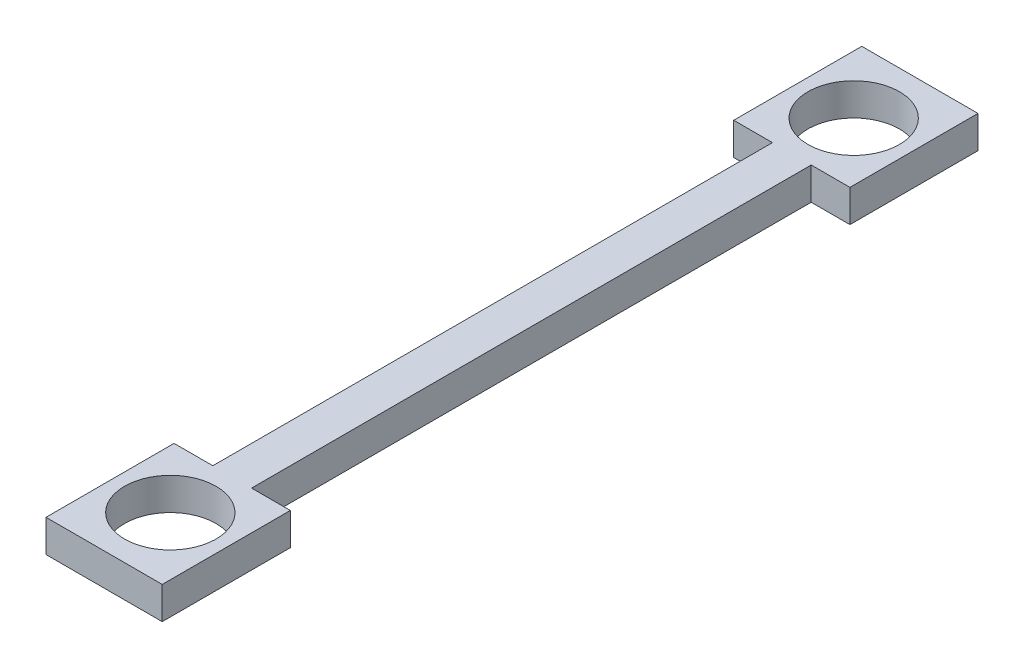
ISO-10303-21;
HEADER;
FILE_DESCRIPTION(('STEP AP214'),'2;1');
FILE_NAME('part.step','',(''),(''),'','','');
FILE_SCHEMA(('AUTOMOTIVE_DESIGN { 1 0 10303 214 1 1 1 1 }'));
ENDSEC;
DATA;
#1=APPLICATION_CONTEXT('core data for automotive mechanical design processes');
#2=APPLICATION_PROTOCOL_DEFINITION('international standard','automotive_design',2000,#1);
#3=PRODUCT_CONTEXT('',#1,'mechanical');
#4=PRODUCT('Part','Part','',(#3));
#5=PRODUCT_RELATED_PRODUCT_CATEGORY('part','',(#4));
#6=PRODUCT_DEFINITION_FORMATION('','',#4);
#7=PRODUCT_DEFINITION_CONTEXT('part definition',#1,'design');
#8=PRODUCT_DEFINITION('design','',#6,#7);
#9=PRODUCT_DEFINITION_SHAPE('','',#8);
#10=(LENGTH_UNIT() NAMED_UNIT(*) SI_UNIT(.MILLI.,.METRE.));
#11=(NAMED_UNIT(*) PLANE_ANGLE_UNIT() SI_UNIT($,.RADIAN.));
#12=(NAMED_UNIT(*) SI_UNIT($,.STERADIAN.) SOLID_ANGLE_UNIT());
#13=UNCERTAINTY_MEASURE_WITH_UNIT(LENGTH_MEASURE(1.E-05),#10,'distance_accuracy_value','');
#14=(GEOMETRIC_REPRESENTATION_CONTEXT(3) GLOBAL_UNCERTAINTY_ASSIGNED_CONTEXT((#13)) GLOBAL_UNIT_ASSIGNED_CONTEXT((#10,
#11,#12)) REPRESENTATION_CONTEXT('',''));
#15=CARTESIAN_POINT('',(0.,0.,0.));
#16=DIRECTION('',(0.,0.,1.));
#17=DIRECTION('',(1.,0.,0.));
#18=AXIS2_PLACEMENT_3D('',#15,#16,#17);
#19=CARTESIAN_POINT('',(6.50000000000001,3.,-11.5));
#20=DIRECTION('',(0.,0.,1.));
#21=DIRECTION('',(1.,0.,0.));
#22=AXIS2_PLACEMENT_3D('',#19,#20,#21);
#23=PLANE('',#22);
#24=DIRECTION('',(-1.,0.,0.));
#25=VECTOR('',#24,1.);
#26=CARTESIAN_POINT('',(6.50000000000001,0.,-11.5));
#27=LINE('',#26,#25);
#28=CARTESIAN_POINT('',(10.4,0.,-11.5));
#29=VERTEX_POINT('',#28);
#30=CARTESIAN_POINT('',(6.80000000000001,0.,-11.5));
#31=VERTEX_POINT('',#30);
#32=EDGE_CURVE('E147',#29,#31,#27,.T.);
#33=ORIENTED_EDGE('',*,*,#32,.T.);
#34=DIRECTION('',(0.,-1.,0.));
#35=VECTOR('',#34,1.);
#36=CARTESIAN_POINT('',(6.80000000000001,3.,-11.5));
#37=LINE('',#36,#35);
#38=CARTESIAN_POINT('',(6.80000000000001,3.,-11.5));
#39=VERTEX_POINT('',#38);
#40=EDGE_CURVE('E146',#39,#31,#37,.T.);
#41=ORIENTED_EDGE('',*,*,#40,.F.);
#42=DIRECTION('',(-1.,0.,0.));
#43=VECTOR('',#42,1.);
#44=CARTESIAN_POINT('',(6.50000000000001,3.,-11.5));
#45=LINE('',#44,#43);
#46=CARTESIAN_POINT('',(10.4,3.,-11.5));
#47=VERTEX_POINT('',#46);
#48=EDGE_CURVE('E132',#47,#39,#45,.T.);
#49=ORIENTED_EDGE('',*,*,#48,.F.);
#50=DIRECTION('',(0.,1.,0.));
#51=VECTOR('',#50,1.);
#52=CARTESIAN_POINT('',(10.4,0.,-11.5));
#53=LINE('',#52,#51);
#54=EDGE_CURVE('E215',#29,#47,#53,.T.);
#55=ORIENTED_EDGE('',*,*,#54,.F.);
#56=EDGE_LOOP('',(#33,#41,#49,#55));
#57=FACE_BOUND('',#56,.T.);
#58=ADVANCED_FACE('F42',(#57),#23,.F.);
#59=CARTESIAN_POINT('',(6.50000000000001,3.,-63.5));
#60=DIRECTION('',(0.,0.,-1.));
#61=DIRECTION('',(-1.,0.,0.));
#62=AXIS2_PLACEMENT_3D('',#59,#60,#61);
#63=PLANE('',#62);
#64=DIRECTION('',(1.,0.,0.));
#65=VECTOR('',#64,1.);
#66=CARTESIAN_POINT('',(6.50000000000001,3.,-63.5));
#67=LINE('',#66,#65);
#68=CARTESIAN_POINT('',(6.80000000000001,3.,-63.5));
#69=VERTEX_POINT('',#68);
#70=CARTESIAN_POINT('',(10.4,3.,-63.5));
#71=VERTEX_POINT('',#70);
#72=EDGE_CURVE('E59',#69,#71,#67,.T.);
#73=ORIENTED_EDGE('',*,*,#72,.F.);
#74=DIRECTION('',(0.,1.,0.));
#75=VECTOR('',#74,1.);
#76=CARTESIAN_POINT('',(6.80000000000001,0.,-63.5));
#77=LINE('',#76,#75);
#78=CARTESIAN_POINT('',(6.80000000000001,0.,-63.5));
#79=VERTEX_POINT('',#78);
#80=EDGE_CURVE('E157',#79,#69,#77,.T.);
#81=ORIENTED_EDGE('',*,*,#80,.F.);
#82=DIRECTION('',(1.,0.,0.));
#83=VECTOR('',#82,1.);
#84=CARTESIAN_POINT('',(6.50000000000001,0.,-63.5));
#85=LINE('',#84,#83);
#86=CARTESIAN_POINT('',(10.4,0.,-63.5));
#87=VERTEX_POINT('',#86);
#88=EDGE_CURVE('E273',#79,#87,#85,.T.);
#89=ORIENTED_EDGE('',*,*,#88,.T.);
#90=DIRECTION('',(0.,-1.,0.));
#91=VECTOR('',#90,1.);
#92=CARTESIAN_POINT('',(10.4,3.,-63.5));
#93=LINE('',#92,#91);
#94=EDGE_CURVE('E226',#71,#87,#93,.T.);
#95=ORIENTED_EDGE('',*,*,#94,.F.);
#96=EDGE_LOOP('',(#73,#81,#89,#95));
#97=FACE_BOUND('',#96,.T.);
#98=ADVANCED_FACE('F309',(#97),#63,.F.);
#99=CARTESIAN_POINT('',(0.,3.,-63.5));
#100=DIRECTION('',(0.,0.,-1.));
#101=DIRECTION('',(-1.,0.,0.));
#102=AXIS2_PLACEMENT_3D('',#99,#100,#101);
#103=PLANE('',#102);
#104=DIRECTION('',(1.,0.,0.));
#105=VECTOR('',#104,1.);
#106=CARTESIAN_POINT('',(0.,0.,-63.5));
#107=LINE('',#106,#105);
#108=CARTESIAN_POINT('',(-0.400000000000008,0.,-63.5));
#109=VERTEX_POINT('',#108);
#110=CARTESIAN_POINT('',(3.20000000000001,0.,-63.5));
#111=VERTEX_POINT('',#110);
#112=EDGE_CURVE('E275',#109,#111,#107,.T.);
#113=ORIENTED_EDGE('',*,*,#112,.T.);
#114=DIRECTION('',(0.,-1.,0.));
#115=VECTOR('',#114,1.);
#116=CARTESIAN_POINT('',(3.20000000000001,3.,-63.5));
#117=LINE('',#116,#115);
#118=CARTESIAN_POINT('',(3.20000000000001,3.,-63.5));
#119=VERTEX_POINT('',#118);
#120=EDGE_CURVE('E169',#119,#111,#117,.T.);
#121=ORIENTED_EDGE('',*,*,#120,.F.);
#122=DIRECTION('',(1.,0.,0.));
#123=VECTOR('',#122,1.);
#124=CARTESIAN_POINT('',(0.,3.,-63.5));
#125=LINE('',#124,#123);
#126=CARTESIAN_POINT('',(-0.400000000000008,3.,-63.5));
#127=VERTEX_POINT('',#126);
#128=EDGE_CURVE('E51',#127,#119,#125,.T.);
#129=ORIENTED_EDGE('',*,*,#128,.F.);
#130=DIRECTION('',(0.,1.,0.));
#131=VECTOR('',#130,1.);
#132=CARTESIAN_POINT('',(-0.400000000000008,0.,-63.5));
#133=LINE('',#132,#131);
#134=EDGE_CURVE('E185',#109,#127,#133,.T.);
#135=ORIENTED_EDGE('',*,*,#134,.F.);
#136=EDGE_LOOP('',(#113,#121,#129,#135));
#137=FACE_BOUND('',#136,.T.);
#138=ADVANCED_FACE('F302',(#137),#103,.F.);
#139=CARTESIAN_POINT('',(0.,3.,-11.5));
#140=DIRECTION('',(0.,0.,1.));
#141=DIRECTION('',(1.,0.,0.));
#142=AXIS2_PLACEMENT_3D('',#139,#140,#141);
#143=PLANE('',#142);
#144=DIRECTION('',(-1.,0.,0.));
#145=VECTOR('',#144,1.);
#146=CARTESIAN_POINT('',(0.,3.,-11.5));
#147=LINE('',#146,#145);
#148=CARTESIAN_POINT('',(3.20000000000001,3.,-11.5));
#149=VERTEX_POINT('',#148);
#150=CARTESIAN_POINT('',(-0.400000000000001,3.,-11.5));
#151=VERTEX_POINT('',#150);
#152=EDGE_CURVE('E11',#149,#151,#147,.T.);
#153=ORIENTED_EDGE('',*,*,#152,.F.);
#154=DIRECTION('',(0.,1.,0.));
#155=VECTOR('',#154,1.);
#156=CARTESIAN_POINT('',(3.20000000000001,0.,-11.5));
#157=LINE('',#156,#155);
#158=CARTESIAN_POINT('',(3.20000000000001,0.,-11.5));
#159=VERTEX_POINT('',#158);
#160=EDGE_CURVE('E177',#159,#149,#157,.T.);
#161=ORIENTED_EDGE('',*,*,#160,.F.);
#162=DIRECTION('',(-1.,0.,0.));
#163=VECTOR('',#162,1.);
#164=CARTESIAN_POINT('',(0.,0.,-11.5));
#165=LINE('',#164,#163);
#166=CARTESIAN_POINT('',(-0.400000000000001,0.,-11.5));
#167=VERTEX_POINT('',#166);
#168=EDGE_CURVE('E45',#159,#167,#165,.T.);
#169=ORIENTED_EDGE('',*,*,#168,.T.);
#170=DIRECTION('',(0.,-1.,0.));
#171=VECTOR('',#170,1.);
#172=CARTESIAN_POINT('',(-0.400000000000001,3.,-11.5));
#173=LINE('',#172,#171);
#174=EDGE_CURVE('E197',#151,#167,#173,.T.);
#175=ORIENTED_EDGE('',*,*,#174,.F.);
#176=EDGE_LOOP('',(#153,#161,#169,#175));
#177=FACE_BOUND('',#176,.T.);
#178=ADVANCED_FACE('F285',(#177),#143,.F.);
#179=CARTESIAN_POINT('',(0.,3.,0.));
#180=DIRECTION('',(0.,-1.,0.));
#181=DIRECTION('',(0.,0.,-1.));
#182=AXIS2_PLACEMENT_3D('',#179,#180,#181);
#183=PLANE('',#182);
#184=DIRECTION('',(0.,0.,1.));
#185=VECTOR('',#184,1.);
#186=CARTESIAN_POINT('',(6.80000000000001,3.,-63.5));
#187=LINE('',#186,#185);
#188=EDGE_CURVE('E137',#69,#39,#187,.T.);
#189=ORIENTED_EDGE('',*,*,#188,.F.);
#190=ORIENTED_EDGE('',*,*,#72,.T.);
#191=DIRECTION('',(0.,0.,1.));
#192=VECTOR('',#191,1.);
#193=CARTESIAN_POINT('',(10.4,3.,-75.4));
#194=LINE('',#193,#192);
#195=CARTESIAN_POINT('',(10.4,3.,-75.4));
#196=VERTEX_POINT('',#195);
#197=EDGE_CURVE('E237',#196,#71,#194,.T.);
#198=ORIENTED_EDGE('',*,*,#197,.F.);
#199=DIRECTION('',(1.,0.,0.));
#200=VECTOR('',#199,1.);
#201=CARTESIAN_POINT('',(0.,3.,-75.4));
#202=LINE('',#201,#200);
#203=CARTESIAN_POINT('',(-0.400000000000009,3.,-75.4));
#204=VERTEX_POINT('',#203);
#205=EDGE_CURVE('E67',#204,#196,#202,.T.);
#206=ORIENTED_EDGE('',*,*,#205,.F.);
#207=DIRECTION('',(0.,0.,-1.));
#208=VECTOR('',#207,1.);
#209=CARTESIAN_POINT('',(-0.400000000000008,3.,-63.5));
#210=LINE('',#209,#208);
#211=EDGE_CURVE('E181',#127,#204,#210,.T.);
#212=ORIENTED_EDGE('',*,*,#211,.F.);
#213=ORIENTED_EDGE('',*,*,#128,.T.);
#214=DIRECTION('',(0.,0.,-1.));
#215=VECTOR('',#214,1.);
#216=CARTESIAN_POINT('',(3.20000000000001,3.,-11.5));
#217=LINE('',#216,#215);
#218=EDGE_CURVE('E165',#149,#119,#217,.T.);
#219=ORIENTED_EDGE('',*,*,#218,.F.);
#220=ORIENTED_EDGE('',*,*,#152,.T.);
#221=DIRECTION('',(0.,0.,-1.));
#222=VECTOR('',#221,1.);
#223=CARTESIAN_POINT('',(-0.4,3.,0.4));
#224=LINE('',#223,#222);
#225=CARTESIAN_POINT('',(-0.4,3.,0.4));
#226=VERTEX_POINT('',#225);
#227=EDGE_CURVE('E209',#226,#151,#224,.T.);
#228=ORIENTED_EDGE('',*,*,#227,.F.);
#229=DIRECTION('',(-1.,0.,0.));
#230=VECTOR('',#229,1.);
#231=CARTESIAN_POINT('',(10.,3.,0.4));
#232=LINE('',#231,#230);
#233=CARTESIAN_POINT('',(10.4,3.,0.4));
#234=VERTEX_POINT('',#233);
#235=EDGE_CURVE('E248',#234,#226,#232,.T.);
#236=ORIENTED_EDGE('',*,*,#235,.F.);
#237=DIRECTION('',(0.,0.,1.));
#238=VECTOR('',#237,1.);
#239=CARTESIAN_POINT('',(10.4,3.,-11.5));
#240=LINE('',#239,#238);
#241=EDGE_CURVE('E139',#47,#234,#240,.T.);
#242=ORIENTED_EDGE('',*,*,#241,.F.);
#243=ORIENTED_EDGE('',*,*,#48,.T.);
#244=EDGE_LOOP('',(#189,#190,#198,#206,#212,#213,#219,#220,#228,#236,#242,#243));
#245=FACE_BOUND('',#244,.T.);
#246=CARTESIAN_POINT('',(5.,3.,-69.25));
#247=DIRECTION('',(0.,1.,0.));
#248=DIRECTION('',(0.,0.,1.));
#249=AXIS2_PLACEMENT_3D('',#246,#247,#248);
#250=CIRCLE('',#249,4.25);
#251=CARTESIAN_POINT('',(5.,3.,-65.));
#252=VERTEX_POINT('',#251);
#253=EDGE_CURVE('E256',#252,#252,#250,.T.);
#254=ORIENTED_EDGE('',*,*,#253,.F.);
#255=EDGE_LOOP('',(#254));
#256=FACE_BOUND('',#255,.T.);
#257=CARTESIAN_POINT('',(5.,3.,-5.74999999999999));
#258=DIRECTION('',(0.,1.,0.));
#259=DIRECTION('',(0.,0.,-1.));
#260=AXIS2_PLACEMENT_3D('',#257,#258,#259);
#261=CIRCLE('',#260,4.25);
#262=CARTESIAN_POINT('',(5.,3.,-9.99999999999999));
#263=VERTEX_POINT('',#262);
#264=EDGE_CURVE('E260',#263,#263,#261,.T.);
#265=ORIENTED_EDGE('',*,*,#264,.F.);
#266=EDGE_LOOP('',(#265));
#267=FACE_BOUND('',#266,.T.);
#268=ADVANCED_FACE('F134',(#245,#256,#267),#183,.F.);
#269=CARTESIAN_POINT('',(0.,0.,0.));
#270=DIRECTION('',(0.,-1.,0.));
#271=DIRECTION('',(0.,0.,-1.));
#272=AXIS2_PLACEMENT_3D('',#269,#270,#271);
#273=PLANE('',#272);
#274=ORIENTED_EDGE('',*,*,#88,.F.);
#275=DIRECTION('',(0.,0.,-1.));
#276=VECTOR('',#275,1.);
#277=CARTESIAN_POINT('',(6.80000000000001,0.,-11.5));
#278=LINE('',#277,#276);
#279=EDGE_CURVE('E152',#31,#79,#278,.T.);
#280=ORIENTED_EDGE('',*,*,#279,.F.);
#281=ORIENTED_EDGE('',*,*,#32,.F.);
#282=DIRECTION('',(0.,0.,-1.));
#283=VECTOR('',#282,1.);
#284=CARTESIAN_POINT('',(10.4,0.,0.4));
#285=LINE('',#284,#283);
#286=CARTESIAN_POINT('',(10.4,0.,0.4));
#287=VERTEX_POINT('',#286);
#288=EDGE_CURVE('E218',#287,#29,#285,.T.);
#289=ORIENTED_EDGE('',*,*,#288,.F.);
#290=DIRECTION('',(1.,0.,0.));
#291=VECTOR('',#290,1.);
#292=CARTESIAN_POINT('',(0.,0.,0.4));
#293=LINE('',#292,#291);
#294=CARTESIAN_POINT('',(-0.4,0.,0.4));
#295=VERTEX_POINT('',#294);
#296=EDGE_CURVE('E245',#295,#287,#293,.T.);
#297=ORIENTED_EDGE('',*,*,#296,.F.);
#298=DIRECTION('',(0.,0.,1.));
#299=VECTOR('',#298,1.);
#300=CARTESIAN_POINT('',(-0.400000000000001,0.,-11.5));
#301=LINE('',#300,#299);
#302=EDGE_CURVE('E201',#167,#295,#301,.T.);
#303=ORIENTED_EDGE('',*,*,#302,.F.);
#304=ORIENTED_EDGE('',*,*,#168,.F.);
#305=DIRECTION('',(0.,0.,1.));
#306=VECTOR('',#305,1.);
#307=CARTESIAN_POINT('',(3.20000000000001,0.,-63.5));
#308=LINE('',#307,#306);
#309=EDGE_CURVE('E173',#111,#159,#308,.T.);
#310=ORIENTED_EDGE('',*,*,#309,.F.);
#311=ORIENTED_EDGE('',*,*,#112,.F.);
#312=DIRECTION('',(0.,0.,1.));
#313=VECTOR('',#312,1.);
#314=CARTESIAN_POINT('',(-0.400000000000009,0.,-75.4));
#315=LINE('',#314,#313);
#316=CARTESIAN_POINT('',(-0.400000000000009,0.,-75.4));
#317=VERTEX_POINT('',#316);
#318=EDGE_CURVE('E189',#317,#109,#315,.T.);
#319=ORIENTED_EDGE('',*,*,#318,.F.);
#320=DIRECTION('',(-1.,0.,0.));
#321=VECTOR('',#320,1.);
#322=CARTESIAN_POINT('',(10.,0.,-75.4));
#323=LINE('',#322,#321);
#324=CARTESIAN_POINT('',(10.4,0.,-75.4));
#325=VERTEX_POINT('',#324);
#326=EDGE_CURVE('E240',#325,#317,#323,.T.);
#327=ORIENTED_EDGE('',*,*,#326,.F.);
#328=DIRECTION('',(0.,0.,-1.));
#329=VECTOR('',#328,1.);
#330=CARTESIAN_POINT('',(10.4,0.,-63.5));
#331=LINE('',#330,#329);
#332=EDGE_CURVE('E230',#87,#325,#331,.T.);
#333=ORIENTED_EDGE('',*,*,#332,.F.);
#334=EDGE_LOOP('',(#274,#280,#281,#289,#297,#303,#304,#310,#311,#319,#327,#333));
#335=FACE_BOUND('',#334,.T.);
#336=CARTESIAN_POINT('',(5.,0.,-69.25));
#337=DIRECTION('',(0.,1.,0.));
#338=DIRECTION('',(0.,0.,1.));
#339=AXIS2_PLACEMENT_3D('',#336,#337,#338);
#340=CIRCLE('',#339,4.25);
#341=CARTESIAN_POINT('',(5.,0.,-65.));
#342=VERTEX_POINT('',#341);
#343=EDGE_CURVE('E252',#342,#342,#340,.T.);
#344=ORIENTED_EDGE('',*,*,#343,.T.);
#345=EDGE_LOOP('',(#344));
#346=FACE_BOUND('',#345,.T.);
#347=CARTESIAN_POINT('',(5.,0.,-5.74999999999999));
#348=DIRECTION('',(0.,1.,0.));
#349=DIRECTION('',(0.,0.,-1.));
#350=AXIS2_PLACEMENT_3D('',#347,#348,#349);
#351=CIRCLE('',#350,4.25);
#352=CARTESIAN_POINT('',(5.,0.,-9.99999999999999));
#353=VERTEX_POINT('',#352);
#354=EDGE_CURVE('E251',#353,#353,#351,.T.);
#355=ORIENTED_EDGE('',*,*,#354,.T.);
#356=EDGE_LOOP('',(#355));
#357=FACE_BOUND('',#356,.T.);
#358=ADVANCED_FACE('F288',(#335,#346,#357),#273,.T.);
#359=CARTESIAN_POINT('',(5.,0.,-5.74999999999999));
#360=DIRECTION('',(0.,1.,0.));
#361=DIRECTION('',(0.,0.,1.));
#362=AXIS2_PLACEMENT_3D('',#359,#360,#361);
#363=CYLINDRICAL_SURFACE('',#362,4.25);
#364=ORIENTED_EDGE('',*,*,#354,.F.);
#365=EDGE_LOOP('',(#364));
#366=FACE_BOUND('',#365,.T.);
#367=ORIENTED_EDGE('',*,*,#264,.T.);
#368=EDGE_LOOP('',(#367));
#369=FACE_BOUND('',#368,.T.);
#370=ADVANCED_FACE('F323',(#366,#369),#363,.F.);
#371=CARTESIAN_POINT('',(5.,0.,-69.25));
#372=DIRECTION('',(0.,1.,0.));
#373=DIRECTION('',(0.,0.,1.));
#374=AXIS2_PLACEMENT_3D('',#371,#372,#373);
#375=CYLINDRICAL_SURFACE('',#374,4.25);
#376=ORIENTED_EDGE('',*,*,#343,.F.);
#377=EDGE_LOOP('',(#376));
#378=FACE_BOUND('',#377,.T.);
#379=ORIENTED_EDGE('',*,*,#253,.T.);
#380=EDGE_LOOP('',(#379));
#381=FACE_BOUND('',#380,.T.);
#382=ADVANCED_FACE('F316',(#378,#381),#375,.F.);
#383=CARTESIAN_POINT('',(0.,0.,0.4));
#384=DIRECTION('',(0.,0.,1.));
#385=DIRECTION('',(1.,0.,0.));
#386=AXIS2_PLACEMENT_3D('',#383,#384,#385);
#387=PLANE('',#386);
#388=ORIENTED_EDGE('',*,*,#235,.T.);
#389=DIRECTION('',(0.,1.,0.));
#390=VECTOR('',#389,1.);
#391=CARTESIAN_POINT('',(-0.4,0.,0.4));
#392=LINE('',#391,#390);
#393=EDGE_CURVE('E205',#295,#226,#392,.T.);
#394=ORIENTED_EDGE('',*,*,#393,.F.);
#395=ORIENTED_EDGE('',*,*,#296,.T.);
#396=DIRECTION('',(0.,-1.,0.));
#397=VECTOR('',#396,1.);
#398=CARTESIAN_POINT('',(10.4,3.,0.4));
#399=LINE('',#398,#397);
#400=EDGE_CURVE('E222',#234,#287,#399,.T.);
#401=ORIENTED_EDGE('',*,*,#400,.F.);
#402=EDGE_LOOP('',(#388,#394,#395,#401));
#403=FACE_BOUND('',#402,.T.);
#404=ADVANCED_FACE('F314',(#403),#387,.T.);
#405=CARTESIAN_POINT('',(0.,0.,-75.4));
#406=DIRECTION('',(0.,0.,-1.));
#407=DIRECTION('',(-1.,0.,0.));
#408=AXIS2_PLACEMENT_3D('',#405,#406,#407);
#409=PLANE('',#408);
#410=ORIENTED_EDGE('',*,*,#205,.T.);
#411=DIRECTION('',(0.,1.,0.));
#412=VECTOR('',#411,1.);
#413=CARTESIAN_POINT('',(10.4,0.,-75.4));
#414=LINE('',#413,#412);
#415=EDGE_CURVE('E234',#325,#196,#414,.T.);
#416=ORIENTED_EDGE('',*,*,#415,.F.);
#417=ORIENTED_EDGE('',*,*,#326,.T.);
#418=DIRECTION('',(0.,-1.,0.));
#419=VECTOR('',#418,1.);
#420=CARTESIAN_POINT('',(-0.400000000000009,3.,-75.4));
#421=LINE('',#420,#419);
#422=EDGE_CURVE('E193',#204,#317,#421,.T.);
#423=ORIENTED_EDGE('',*,*,#422,.F.);
#424=EDGE_LOOP('',(#410,#416,#417,#423));
#425=FACE_BOUND('',#424,.T.);
#426=ADVANCED_FACE('F303',(#425),#409,.T.);
#427=CARTESIAN_POINT('',(10.4,0.,0.));
#428=DIRECTION('',(1.,0.,0.));
#429=DIRECTION('',(0.,0.,-1.));
#430=AXIS2_PLACEMENT_3D('',#427,#428,#429);
#431=PLANE('',#430);
#432=ORIENTED_EDGE('',*,*,#94,.T.);
#433=ORIENTED_EDGE('',*,*,#332,.T.);
#434=ORIENTED_EDGE('',*,*,#415,.T.);
#435=ORIENTED_EDGE('',*,*,#197,.T.);
#436=EDGE_LOOP('',(#432,#433,#434,#435));
#437=FACE_BOUND('',#436,.T.);
#438=ADVANCED_FACE('F306',(#437),#431,.T.);
#439=CARTESIAN_POINT('',(10.4,0.,0.));
#440=DIRECTION('',(1.,0.,0.));
#441=DIRECTION('',(0.,0.,-1.));
#442=AXIS2_PLACEMENT_3D('',#439,#440,#441);
#443=PLANE('',#442);
#444=ORIENTED_EDGE('',*,*,#400,.T.);
#445=ORIENTED_EDGE('',*,*,#288,.T.);
#446=ORIENTED_EDGE('',*,*,#54,.T.);
#447=ORIENTED_EDGE('',*,*,#241,.T.);
#448=EDGE_LOOP('',(#444,#445,#446,#447));
#449=FACE_BOUND('',#448,.T.);
#450=ADVANCED_FACE('F311',(#449),#443,.T.);
#451=CARTESIAN_POINT('',(-0.4,0.,0.));
#452=DIRECTION('',(-1.,0.,0.));
#453=DIRECTION('',(0.,0.,1.));
#454=AXIS2_PLACEMENT_3D('',#451,#452,#453);
#455=PLANE('',#454);
#456=ORIENTED_EDGE('',*,*,#174,.T.);
#457=ORIENTED_EDGE('',*,*,#302,.T.);
#458=ORIENTED_EDGE('',*,*,#393,.T.);
#459=ORIENTED_EDGE('',*,*,#227,.T.);
#460=EDGE_LOOP('',(#456,#457,#458,#459));
#461=FACE_BOUND('',#460,.T.);
#462=ADVANCED_FACE('F293',(#461),#455,.T.);
#463=CARTESIAN_POINT('',(-0.4,0.,0.));
#464=DIRECTION('',(-1.,0.,0.));
#465=DIRECTION('',(0.,0.,1.));
#466=AXIS2_PLACEMENT_3D('',#463,#464,#465);
#467=PLANE('',#466);
#468=ORIENTED_EDGE('',*,*,#422,.T.);
#469=ORIENTED_EDGE('',*,*,#318,.T.);
#470=ORIENTED_EDGE('',*,*,#134,.T.);
#471=ORIENTED_EDGE('',*,*,#211,.T.);
#472=EDGE_LOOP('',(#468,#469,#470,#471));
#473=FACE_BOUND('',#472,.T.);
#474=ADVANCED_FACE('F300',(#473),#467,.T.);
#475=CARTESIAN_POINT('',(3.20000000000001,0.,0.));
#476=DIRECTION('',(-1.,0.,0.));
#477=DIRECTION('',(0.,0.,1.));
#478=AXIS2_PLACEMENT_3D('',#475,#476,#477);
#479=PLANE('',#478);
#480=ORIENTED_EDGE('',*,*,#218,.T.);
#481=ORIENTED_EDGE('',*,*,#120,.T.);
#482=ORIENTED_EDGE('',*,*,#309,.T.);
#483=ORIENTED_EDGE('',*,*,#160,.T.);
#484=EDGE_LOOP('',(#480,#481,#482,#483));
#485=FACE_BOUND('',#484,.T.);
#486=ADVANCED_FACE('F297',(#485),#479,.T.);
#487=CARTESIAN_POINT('',(6.80000000000001,0.,0.));
#488=DIRECTION('',(1.,0.,0.));
#489=DIRECTION('',(0.,0.,-1.));
#490=AXIS2_PLACEMENT_3D('',#487,#488,#489);
#491=PLANE('',#490);
#492=ORIENTED_EDGE('',*,*,#188,.T.);
#493=ORIENTED_EDGE('',*,*,#40,.T.);
#494=ORIENTED_EDGE('',*,*,#279,.T.);
#495=ORIENTED_EDGE('',*,*,#80,.T.);
#496=EDGE_LOOP('',(#492,#493,#494,#495));
#497=FACE_BOUND('',#496,.T.);
#498=ADVANCED_FACE('F155',(#497),#491,.T.);
#499=CLOSED_SHELL('',(#58,#98,#138,#178,#268,#358,#370,#382,#404,#426,#438,#450,#462,#474,#486,#498));
#500=MANIFOLD_SOLID_BREP('B2',#499);
#501=ADVANCED_BREP_SHAPE_REPRESENTATION('',(#18,#500),#14);
#502=SHAPE_DEFINITION_REPRESENTATION(#9,#501);
ENDSEC;
END-ISO-10303-21;
